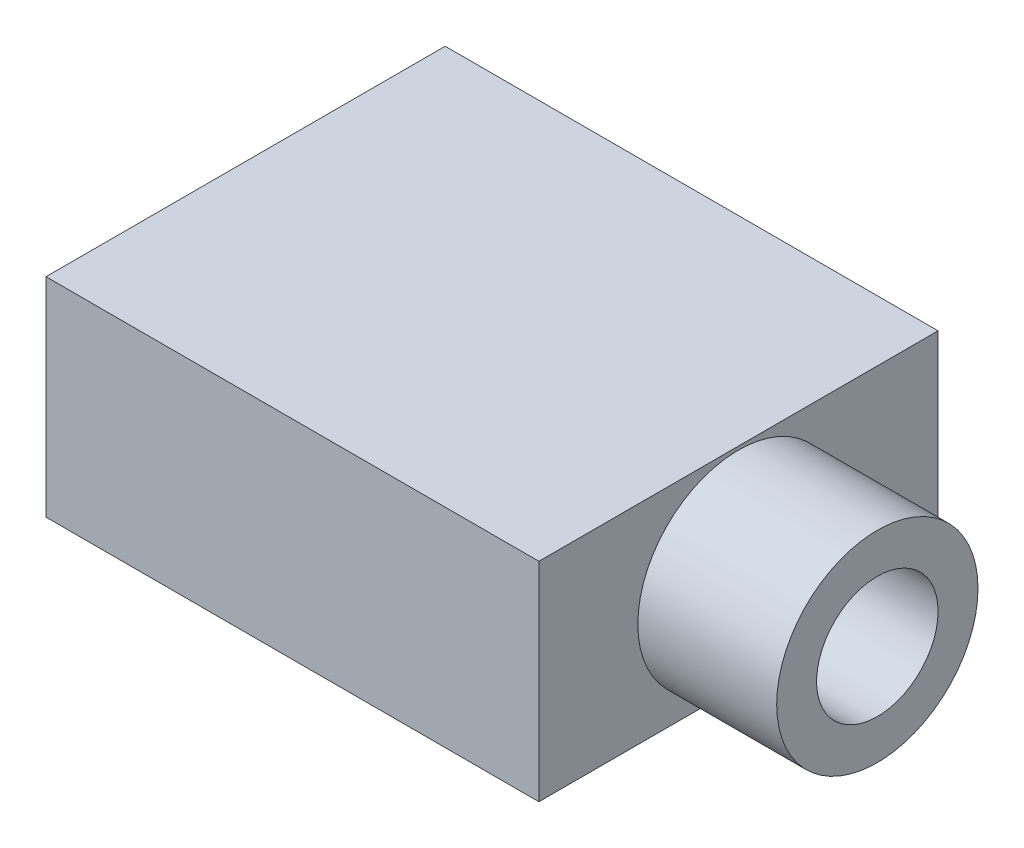
ISO-10303-21;
HEADER;
FILE_DESCRIPTION(('STEP AP214'),'2;1');
FILE_NAME('part.step','',(''),(''),'','','');
FILE_SCHEMA(('AUTOMOTIVE_DESIGN { 1 0 10303 214 1 1 1 1 }'));
ENDSEC;
DATA;
#1=APPLICATION_CONTEXT('core data for automotive mechanical design processes');
#2=APPLICATION_PROTOCOL_DEFINITION('international standard','automotive_design',2000,#1);
#3=PRODUCT_CONTEXT('',#1,'mechanical');
#4=PRODUCT('Part','Part','',(#3));
#5=PRODUCT_RELATED_PRODUCT_CATEGORY('part','',(#4));
#6=PRODUCT_DEFINITION_FORMATION('','',#4);
#7=PRODUCT_DEFINITION_CONTEXT('part definition',#1,'design');
#8=PRODUCT_DEFINITION('design','',#6,#7);
#9=PRODUCT_DEFINITION_SHAPE('','',#8);
#10=(LENGTH_UNIT() NAMED_UNIT(*) SI_UNIT(.MILLI.,.METRE.));
#11=(NAMED_UNIT(*) PLANE_ANGLE_UNIT() SI_UNIT($,.RADIAN.));
#12=(NAMED_UNIT(*) SI_UNIT($,.STERADIAN.) SOLID_ANGLE_UNIT());
#13=UNCERTAINTY_MEASURE_WITH_UNIT(LENGTH_MEASURE(1.E-05),#10,'distance_accuracy_value','');
#14=(GEOMETRIC_REPRESENTATION_CONTEXT(3) GLOBAL_UNCERTAINTY_ASSIGNED_CONTEXT((#13)) GLOBAL_UNIT_ASSIGNED_CONTEXT((#10,
#11,#12)) REPRESENTATION_CONTEXT('',''));
#15=CARTESIAN_POINT('',(0.,0.,0.));
#16=DIRECTION('',(0.,0.,1.));
#17=DIRECTION('',(1.,0.,0.));
#18=AXIS2_PLACEMENT_3D('',#15,#16,#17);
#19=CARTESIAN_POINT('',(-51.3045871559632,6.,-44.3119266055053));
#20=DIRECTION('',(-1.,0.,0.));
#21=DIRECTION('',(0.,0.,1.));
#22=AXIS2_PLACEMENT_3D('',#19,#20,#21);
#23=PLANE('',#22);
#24=CARTESIAN_POINT('',(-51.3045871559632,3.,-38.5619266055053));
#25=DIRECTION('',(-1.,0.,0.));
#26=DIRECTION('',(0.,0.,1.));
#27=AXIS2_PLACEMENT_3D('',#24,#25,#26);
#28=CIRCLE('',#27,2.9);
#29=CARTESIAN_POINT('',(-51.3045871559632,3.,-35.6619266055053));
#30=VERTEX_POINT('',#29);
#31=EDGE_CURVE('E11',#30,#30,#28,.F.);
#32=ORIENTED_EDGE('',*,*,#31,.F.);
#33=EDGE_LOOP('',(#32));
#34=FACE_BOUND('',#33,.T.);
#35=DIRECTION('',(0.,0.,-1.));
#36=VECTOR('',#35,1.);
#37=CARTESIAN_POINT('',(-51.3045871559632,0.,-44.3119266055053));
#38=LINE('',#37,#36);
#39=CARTESIAN_POINT('',(-51.3045871559632,0.,-32.8119266055053));
#40=VERTEX_POINT('',#39);
#41=CARTESIAN_POINT('',(-51.3045871559632,0.,-44.3119266055053));
#42=VERTEX_POINT('',#41);
#43=EDGE_CURVE('E100',#40,#42,#38,.T.);
#44=ORIENTED_EDGE('',*,*,#43,.T.);
#45=DIRECTION('',(0.,-1.,0.));
#46=VECTOR('',#45,1.);
#47=CARTESIAN_POINT('',(-51.3045871559632,6.,-44.3119266055053));
#48=LINE('',#47,#46);
#49=CARTESIAN_POINT('',(-51.3045871559632,6.,-44.3119266055053));
#50=VERTEX_POINT('',#49);
#51=EDGE_CURVE('E42',#50,#42,#48,.T.);
#52=ORIENTED_EDGE('',*,*,#51,.F.);
#53=DIRECTION('',(0.,0.,-1.));
#54=VECTOR('',#53,1.);
#55=CARTESIAN_POINT('',(-51.3045871559632,6.,-44.3119266055053));
#56=LINE('',#55,#54);
#57=CARTESIAN_POINT('',(-51.3045871559632,6.,-32.8119266055053));
#58=VERTEX_POINT('',#57);
#59=EDGE_CURVE('E86',#58,#50,#56,.T.);
#60=ORIENTED_EDGE('',*,*,#59,.F.);
#61=DIRECTION('',(0.,-1.,0.));
#62=VECTOR('',#61,1.);
#63=CARTESIAN_POINT('',(-51.3045871559632,6.,-32.8119266055053));
#64=LINE('',#63,#62);
#65=EDGE_CURVE('E96',#58,#40,#64,.T.);
#66=ORIENTED_EDGE('',*,*,#65,.T.);
#67=EDGE_LOOP('',(#44,#52,#60,#66));
#68=FACE_BOUND('',#67,.T.);
#69=ADVANCED_FACE('F34',(#34,#68),#23,.F.);
#70=CARTESIAN_POINT('',(-51.3045871559632,6.,-44.3119266055053));
#71=DIRECTION('',(0.,0.,1.));
#72=DIRECTION('',(1.,0.,0.));
#73=AXIS2_PLACEMENT_3D('',#70,#71,#72);
#74=PLANE('',#73);
#75=DIRECTION('',(-1.,0.,0.));
#76=VECTOR('',#75,1.);
#77=CARTESIAN_POINT('',(-51.3045871559632,0.,-44.3119266055053));
#78=LINE('',#77,#76);
#79=CARTESIAN_POINT('',(-65.5045871559632,0.,-44.3119266055053));
#80=VERTEX_POINT('',#79);
#81=EDGE_CURVE('E91',#42,#80,#78,.T.);
#82=ORIENTED_EDGE('',*,*,#81,.T.);
#83=DIRECTION('',(0.,-1.,0.));
#84=VECTOR('',#83,1.);
#85=CARTESIAN_POINT('',(-65.5045871559632,6.,-44.3119266055053));
#86=LINE('',#85,#84);
#87=CARTESIAN_POINT('',(-65.5045871559632,6.,-44.3119266055053));
#88=VERTEX_POINT('',#87);
#89=EDGE_CURVE('E89',#88,#80,#86,.T.);
#90=ORIENTED_EDGE('',*,*,#89,.F.);
#91=DIRECTION('',(-1.,0.,0.));
#92=VECTOR('',#91,1.);
#93=CARTESIAN_POINT('',(-51.3045871559632,6.,-44.3119266055053));
#94=LINE('',#93,#92);
#95=EDGE_CURVE('E81',#50,#88,#94,.T.);
#96=ORIENTED_EDGE('',*,*,#95,.F.);
#97=ORIENTED_EDGE('',*,*,#51,.T.);
#98=EDGE_LOOP('',(#82,#90,#96,#97));
#99=FACE_BOUND('',#98,.T.);
#100=ADVANCED_FACE('F90',(#99),#74,.F.);
#101=CARTESIAN_POINT('',(-65.5045871559632,6.,-44.3119266055053));
#102=DIRECTION('',(1.,0.,0.));
#103=DIRECTION('',(0.,0.,-1.));
#104=AXIS2_PLACEMENT_3D('',#101,#102,#103);
#105=PLANE('',#104);
#106=DIRECTION('',(0.,0.,1.));
#107=VECTOR('',#106,1.);
#108=CARTESIAN_POINT('',(-65.5045871559632,0.,-44.3119266055053));
#109=LINE('',#108,#107);
#110=CARTESIAN_POINT('',(-65.5045871559632,0.,-32.8119266055053));
#111=VERTEX_POINT('',#110);
#112=EDGE_CURVE('E67',#80,#111,#109,.T.);
#113=ORIENTED_EDGE('',*,*,#112,.T.);
#114=DIRECTION('',(0.,-1.,0.));
#115=VECTOR('',#114,1.);
#116=CARTESIAN_POINT('',(-65.5045871559632,6.,-32.8119266055053));
#117=LINE('',#116,#115);
#118=CARTESIAN_POINT('',(-65.5045871559632,6.,-32.8119266055053));
#119=VERTEX_POINT('',#118);
#120=EDGE_CURVE('E92',#119,#111,#117,.T.);
#121=ORIENTED_EDGE('',*,*,#120,.F.);
#122=DIRECTION('',(0.,0.,1.));
#123=VECTOR('',#122,1.);
#124=CARTESIAN_POINT('',(-65.5045871559632,6.,-44.3119266055053));
#125=LINE('',#124,#123);
#126=EDGE_CURVE('E84',#88,#119,#125,.T.);
#127=ORIENTED_EDGE('',*,*,#126,.F.);
#128=ORIENTED_EDGE('',*,*,#89,.T.);
#129=EDGE_LOOP('',(#113,#121,#127,#128));
#130=FACE_BOUND('',#129,.T.);
#131=ADVANCED_FACE('F94',(#130),#105,.F.);
#132=CARTESIAN_POINT('',(-51.3045871559632,6.,-32.8119266055053));
#133=DIRECTION('',(0.,0.,-1.));
#134=DIRECTION('',(-1.,0.,0.));
#135=AXIS2_PLACEMENT_3D('',#132,#133,#134);
#136=PLANE('',#135);
#137=DIRECTION('',(1.,0.,0.));
#138=VECTOR('',#137,1.);
#139=CARTESIAN_POINT('',(-51.3045871559632,0.,-32.8119266055053));
#140=LINE('',#139,#138);
#141=EDGE_CURVE('E73',#111,#40,#140,.T.);
#142=ORIENTED_EDGE('',*,*,#141,.T.);
#143=ORIENTED_EDGE('',*,*,#65,.F.);
#144=DIRECTION('',(1.,0.,0.));
#145=VECTOR('',#144,1.);
#146=CARTESIAN_POINT('',(-51.3045871559632,6.,-32.8119266055053));
#147=LINE('',#146,#145);
#148=EDGE_CURVE('E50',#119,#58,#147,.T.);
#149=ORIENTED_EDGE('',*,*,#148,.F.);
#150=ORIENTED_EDGE('',*,*,#120,.T.);
#151=EDGE_LOOP('',(#142,#143,#149,#150));
#152=FACE_BOUND('',#151,.T.);
#153=ADVANCED_FACE('F122',(#152),#136,.F.);
#154=CARTESIAN_POINT('',(0.,6.,0.));
#155=DIRECTION('',(0.,-1.,0.));
#156=DIRECTION('',(0.,0.,-1.));
#157=AXIS2_PLACEMENT_3D('',#154,#155,#156);
#158=PLANE('',#157);
#159=ORIENTED_EDGE('',*,*,#59,.T.);
#160=ORIENTED_EDGE('',*,*,#95,.T.);
#161=ORIENTED_EDGE('',*,*,#126,.T.);
#162=ORIENTED_EDGE('',*,*,#148,.T.);
#163=EDGE_LOOP('',(#159,#160,#161,#162));
#164=FACE_BOUND('',#163,.T.);
#165=ADVANCED_FACE('F82',(#164),#158,.F.);
#166=CARTESIAN_POINT('',(0.,0.,0.));
#167=DIRECTION('',(0.,-1.,0.));
#168=DIRECTION('',(0.,0.,-1.));
#169=AXIS2_PLACEMENT_3D('',#166,#167,#168);
#170=PLANE('',#169);
#171=ORIENTED_EDGE('',*,*,#43,.F.);
#172=ORIENTED_EDGE('',*,*,#141,.F.);
#173=ORIENTED_EDGE('',*,*,#112,.F.);
#174=ORIENTED_EDGE('',*,*,#81,.F.);
#175=EDGE_LOOP('',(#171,#172,#173,#174));
#176=FACE_BOUND('',#175,.T.);
#177=ADVANCED_FACE('F111',(#176),#170,.T.);
#178=CARTESIAN_POINT('',(-47.3045871559633,3.,-38.5619266055053));
#179=DIRECTION('',(-1.,0.,0.));
#180=DIRECTION('',(0.,0.,1.));
#181=AXIS2_PLACEMENT_3D('',#178,#179,#180);
#182=CYLINDRICAL_SURFACE('',#181,2.9);
#183=CARTESIAN_POINT('',(-47.3045871559633,3.,-38.5619266055053));
#184=DIRECTION('',(1.,0.,0.));
#185=DIRECTION('',(0.,0.,-1.));
#186=AXIS2_PLACEMENT_3D('',#183,#184,#185);
#187=CIRCLE('',#186,2.9);
#188=CARTESIAN_POINT('',(-47.3045871559633,3.,-41.4619266055053));
#189=VERTEX_POINT('',#188);
#190=EDGE_CURVE('E103',#189,#189,#187,.T.);
#191=ORIENTED_EDGE('',*,*,#190,.F.);
#192=EDGE_LOOP('',(#191));
#193=FACE_BOUND('',#192,.T.);
#194=ORIENTED_EDGE('',*,*,#31,.T.);
#195=EDGE_LOOP('',(#194));
#196=FACE_BOUND('',#195,.T.);
#197=ADVANCED_FACE('F113',(#193,#196),#182,.T.);
#198=CARTESIAN_POINT('',(-47.3045871559633,3.,-38.5619266055053));
#199=DIRECTION('',(1.,0.,0.));
#200=DIRECTION('',(0.,0.,-1.));
#201=AXIS2_PLACEMENT_3D('',#198,#199,#200);
#202=PLANE('',#201);
#203=CARTESIAN_POINT('',(-47.3045871559633,3.,-38.5619266055053));
#204=DIRECTION('',(1.,0.,0.));
#205=DIRECTION('',(0.,0.,-1.));
#206=AXIS2_PLACEMENT_3D('',#203,#204,#205);
#207=CIRCLE('',#206,1.75);
#208=CARTESIAN_POINT('',(-47.3045871559633,3.,-40.3119266055053));
#209=VERTEX_POINT('',#208);
#210=EDGE_CURVE('E202',#209,#209,#207,.T.);
#211=ORIENTED_EDGE('',*,*,#210,.F.);
#212=EDGE_LOOP('',(#211));
#213=FACE_BOUND('',#212,.T.);
#214=ORIENTED_EDGE('',*,*,#190,.T.);
#215=EDGE_LOOP('',(#214));
#216=FACE_BOUND('',#215,.T.);
#217=ADVANCED_FACE('F119',(#213,#216),#202,.T.);
#218=CARTESIAN_POINT('',(-62.3045871559633,3.,-38.5619266055053));
#219=DIRECTION('',(1.,0.,0.));
#220=DIRECTION('',(0.,0.,-1.));
#221=AXIS2_PLACEMENT_3D('',#218,#219,#220);
#222=CYLINDRICAL_SURFACE('',#221,1.75);
#223=CARTESIAN_POINT('',(-62.3045871559633,3.,-38.5619266055053));
#224=DIRECTION('',(1.,0.,0.));
#225=DIRECTION('',(0.,0.,-1.));
#226=AXIS2_PLACEMENT_3D('',#223,#224,#225);
#227=CIRCLE('',#226,1.75);
#228=CARTESIAN_POINT('',(-62.3045871559633,3.,-40.3119266055053));
#229=VERTEX_POINT('',#228);
#230=EDGE_CURVE('E201',#229,#229,#227,.T.);
#231=ORIENTED_EDGE('',*,*,#230,.F.);
#232=EDGE_LOOP('',(#231));
#233=FACE_BOUND('',#232,.T.);
#234=ORIENTED_EDGE('',*,*,#210,.T.);
#235=EDGE_LOOP('',(#234));
#236=FACE_BOUND('',#235,.T.);
#237=ADVANCED_FACE('F171',(#233,#236),#222,.F.);
#238=CARTESIAN_POINT('',(-62.3045871559633,3.,-38.5619266055053));
#239=DIRECTION('',(1.,0.,0.));
#240=DIRECTION('',(0.,0.,-1.));
#241=AXIS2_PLACEMENT_3D('',#238,#239,#240);
#242=PLANE('',#241);
#243=ORIENTED_EDGE('',*,*,#230,.T.);
#244=EDGE_LOOP('',(#243));
#245=FACE_BOUND('',#244,.T.);
#246=ADVANCED_FACE('F182',(#245),#242,.T.);
#247=CLOSED_SHELL('',(#69,#100,#131,#153,#165,#177,#197,#217,#237,#246));
#248=MANIFOLD_SOLID_BREP('B2',#247);
#249=ADVANCED_BREP_SHAPE_REPRESENTATION('',(#18,#248),#14);
#250=SHAPE_DEFINITION_REPRESENTATION(#9,#249);
ENDSEC;
END-ISO-10303-21;
